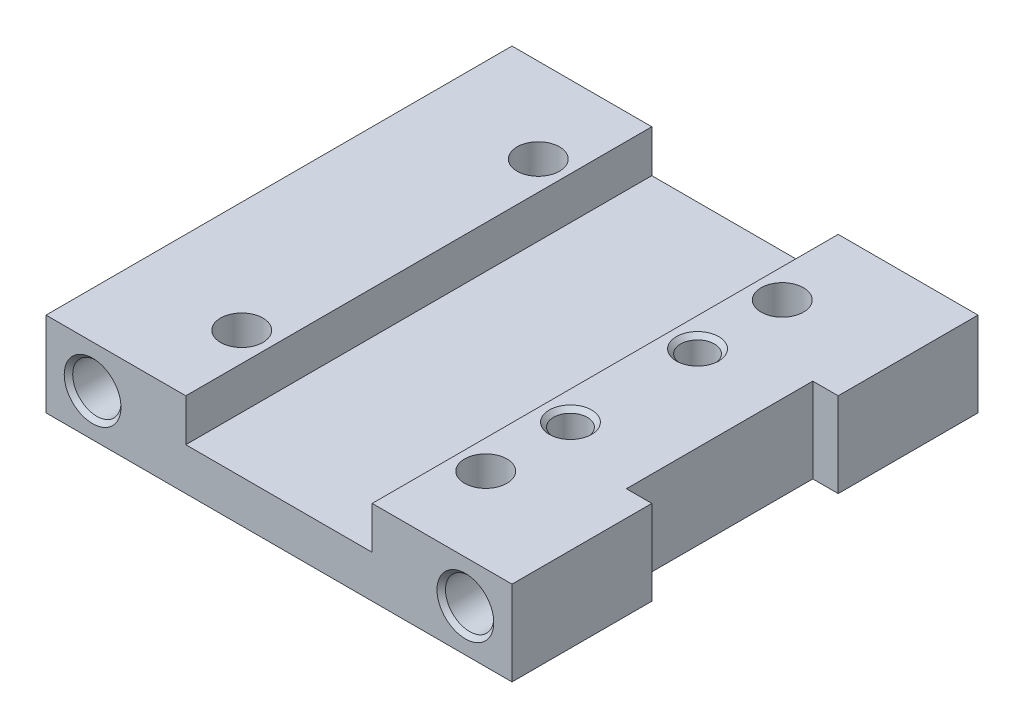
ISO-10303-21;
HEADER;
FILE_DESCRIPTION(('STEP AP214'),'2;1');
FILE_NAME('part.step','',(''),(''),'','','');
FILE_SCHEMA(('AUTOMOTIVE_DESIGN { 1 0 10303 214 1 1 1 1 }'));
ENDSEC;
DATA;
#1=APPLICATION_CONTEXT('core data for automotive mechanical design processes');
#2=APPLICATION_PROTOCOL_DEFINITION('international standard','automotive_design',2000,#1);
#3=PRODUCT_CONTEXT('',#1,'mechanical');
#4=PRODUCT('Part','Part','',(#3));
#5=PRODUCT_RELATED_PRODUCT_CATEGORY('part','',(#4));
#6=PRODUCT_DEFINITION_FORMATION('','',#4);
#7=PRODUCT_DEFINITION_CONTEXT('part definition',#1,'design');
#8=PRODUCT_DEFINITION('design','',#6,#7);
#9=PRODUCT_DEFINITION_SHAPE('','',#8);
#10=(LENGTH_UNIT() NAMED_UNIT(*) SI_UNIT(.MILLI.,.METRE.));
#11=(NAMED_UNIT(*) PLANE_ANGLE_UNIT() SI_UNIT($,.RADIAN.));
#12=(NAMED_UNIT(*) SI_UNIT($,.STERADIAN.) SOLID_ANGLE_UNIT());
#13=UNCERTAINTY_MEASURE_WITH_UNIT(LENGTH_MEASURE(1.E-05),#10,'distance_accuracy_value','');
#14=(GEOMETRIC_REPRESENTATION_CONTEXT(3) GLOBAL_UNCERTAINTY_ASSIGNED_CONTEXT((#13)) GLOBAL_UNIT_ASSIGNED_CONTEXT((#10,
#11,#12)) REPRESENTATION_CONTEXT('',''));
#15=CARTESIAN_POINT('',(0.,0.,0.));
#16=DIRECTION('',(0.,0.,1.));
#17=DIRECTION('',(1.,0.,0.));
#18=AXIS2_PLACEMENT_3D('',#15,#16,#17);
#19=CARTESIAN_POINT('',(0.,5.,0.));
#20=DIRECTION('',(0.,1.,0.));
#21=DIRECTION('',(0.,0.,1.));
#22=AXIS2_PLACEMENT_3D('',#19,#20,#21);
#23=PLANE('',#22);
#24=DIRECTION('',(0.,0.,-1.));
#25=VECTOR('',#24,1.);
#26=CARTESIAN_POINT('',(11.,5.,-27.5));
#27=LINE('',#26,#25);
#28=CARTESIAN_POINT('',(11.,5.,27.5));
#29=VERTEX_POINT('',#28);
#30=CARTESIAN_POINT('',(11.,5.,-27.5));
#31=VERTEX_POINT('',#30);
#32=EDGE_CURVE('E132',#29,#31,#27,.T.);
#33=ORIENTED_EDGE('',*,*,#32,.F.);
#34=DIRECTION('',(1.,0.,0.));
#35=VECTOR('',#34,1.);
#36=CARTESIAN_POINT('',(0.,5.,27.5));
#37=LINE('',#36,#35);
#38=CARTESIAN_POINT('',(27.5,5.,27.5));
#39=VERTEX_POINT('',#38);
#40=EDGE_CURVE('E122',#29,#39,#37,.T.);
#41=ORIENTED_EDGE('',*,*,#40,.T.);
#42=DIRECTION('',(0.,0.,1.));
#43=VECTOR('',#42,1.);
#44=CARTESIAN_POINT('',(27.5,5.,0.));
#45=LINE('',#44,#43);
#46=CARTESIAN_POINT('',(27.5,5.,11.));
#47=VERTEX_POINT('',#46);
#48=EDGE_CURVE('E126',#47,#39,#45,.T.);
#49=ORIENTED_EDGE('',*,*,#48,.F.);
#50=DIRECTION('',(-1.,0.,0.));
#51=VECTOR('',#50,1.);
#52=CARTESIAN_POINT('',(0.,5.,11.));
#53=LINE('',#52,#51);
#54=CARTESIAN_POINT('',(24.5,5.,11.));
#55=VERTEX_POINT('',#54);
#56=EDGE_CURVE('E70',#47,#55,#53,.T.);
#57=ORIENTED_EDGE('',*,*,#56,.T.);
#58=DIRECTION('',(0.,0.,1.));
#59=VECTOR('',#58,1.);
#60=CARTESIAN_POINT('',(24.5,5.,0.));
#61=LINE('',#60,#59);
#62=CARTESIAN_POINT('',(24.5,5.,-11.));
#63=VERTEX_POINT('',#62);
#64=EDGE_CURVE('E167',#63,#55,#61,.T.);
#65=ORIENTED_EDGE('',*,*,#64,.F.);
#66=DIRECTION('',(-1.,0.,0.));
#67=VECTOR('',#66,1.);
#68=CARTESIAN_POINT('',(0.,5.,-11.));
#69=LINE('',#68,#67);
#70=CARTESIAN_POINT('',(27.5,5.,-11.));
#71=VERTEX_POINT('',#70);
#72=EDGE_CURVE('E159',#71,#63,#69,.T.);
#73=ORIENTED_EDGE('',*,*,#72,.F.);
#74=CARTESIAN_POINT('',(27.5,5.,-27.5));
#75=VERTEX_POINT('',#74);
#76=EDGE_CURVE('E155',#75,#71,#45,.T.);
#77=ORIENTED_EDGE('',*,*,#76,.F.);
#78=DIRECTION('',(1.,0.,0.));
#79=VECTOR('',#78,1.);
#80=CARTESIAN_POINT('',(0.,5.,-27.5));
#81=LINE('',#80,#79);
#82=EDGE_CURVE('E157',#31,#75,#81,.T.);
#83=ORIENTED_EDGE('',*,*,#82,.F.);
#84=EDGE_LOOP('',(#33,#41,#49,#57,#65,#73,#77,#83));
#85=FACE_BOUND('',#84,.T.);
#86=CARTESIAN_POINT('',(14.4,5.,-17.5));
#87=DIRECTION('',(0.,1.,0.));
#88=DIRECTION('',(0.,0.,1.));
#89=AXIS2_PLACEMENT_3D('',#86,#87,#88);
#90=CIRCLE('',#89,2.5);
#91=CARTESIAN_POINT('',(14.4,5.,-15.));
#92=VERTEX_POINT('',#91);
#93=EDGE_CURVE('E166',#92,#92,#90,.T.);
#94=ORIENTED_EDGE('',*,*,#93,.F.);
#95=EDGE_LOOP('',(#94));
#96=FACE_BOUND('',#95,.T.);
#97=CARTESIAN_POINT('',(14.4,5.,17.5));
#98=DIRECTION('',(0.,1.,0.));
#99=DIRECTION('',(0.,0.,1.));
#100=AXIS2_PLACEMENT_3D('',#97,#98,#99);
#101=CIRCLE('',#100,2.5);
#102=CARTESIAN_POINT('',(14.4,5.,20.));
#103=VERTEX_POINT('',#102);
#104=EDGE_CURVE('E173',#103,#103,#101,.T.);
#105=ORIENTED_EDGE('',*,*,#104,.F.);
#106=EDGE_LOOP('',(#105));
#107=FACE_BOUND('',#106,.T.);
#108=CARTESIAN_POINT('',(14.4,5.,-7.5));
#109=DIRECTION('',(0.,1.,0.));
#110=DIRECTION('',(0.,0.,1.));
#111=AXIS2_PLACEMENT_3D('',#108,#109,#110);
#112=CIRCLE('',#111,2.5);
#113=CARTESIAN_POINT('',(14.4,5.,-5.));
#114=VERTEX_POINT('',#113);
#115=EDGE_CURVE('E650',#114,#114,#112,.F.);
#116=ORIENTED_EDGE('',*,*,#115,.T.);
#117=EDGE_LOOP('',(#116));
#118=FACE_BOUND('',#117,.T.);
#119=CARTESIAN_POINT('',(14.4,5.,7.5));
#120=DIRECTION('',(0.,1.,0.));
#121=DIRECTION('',(0.,0.,1.));
#122=AXIS2_PLACEMENT_3D('',#119,#120,#121);
#123=CIRCLE('',#122,2.50000000000002);
#124=CARTESIAN_POINT('',(14.4,5.,10.));
#125=VERTEX_POINT('',#124);
#126=EDGE_CURVE('E649',#125,#125,#123,.F.);
#127=ORIENTED_EDGE('',*,*,#126,.T.);
#128=EDGE_LOOP('',(#127));
#129=FACE_BOUND('',#128,.T.);
#130=ADVANCED_FACE('F45',(#85,#96,#107,#118,#129),#23,.T.);
#131=CARTESIAN_POINT('',(0.,5.,-27.5));
#132=DIRECTION('',(0.,0.,-1.));
#133=DIRECTION('',(-1.,0.,0.));
#134=AXIS2_PLACEMENT_3D('',#131,#132,#133);
#135=PLANE('',#134);
#136=CARTESIAN_POINT('',(-22.,0.,-27.5));
#137=DIRECTION('',(0.,0.,-1.));
#138=DIRECTION('',(-1.,0.,0.));
#139=AXIS2_PLACEMENT_3D('',#136,#137,#138);
#140=CIRCLE('',#139,3.35);
#141=CARTESIAN_POINT('',(-25.35,0.,-27.5));
#142=VERTEX_POINT('',#141);
#143=EDGE_CURVE('E658',#142,#142,#140,.F.);
#144=ORIENTED_EDGE('',*,*,#143,.T.);
#145=EDGE_LOOP('',(#144));
#146=FACE_BOUND('',#145,.T.);
#147=CARTESIAN_POINT('',(22.,0.,-27.5));
#148=DIRECTION('',(0.,0.,-1.));
#149=DIRECTION('',(-1.,0.,0.));
#150=AXIS2_PLACEMENT_3D('',#147,#148,#149);
#151=CIRCLE('',#150,3.35);
#152=CARTESIAN_POINT('',(18.65,0.,-27.5));
#153=VERTEX_POINT('',#152);
#154=EDGE_CURVE('E656',#153,#153,#151,.F.);
#155=ORIENTED_EDGE('',*,*,#154,.T.);
#156=EDGE_LOOP('',(#155));
#157=FACE_BOUND('',#156,.T.);
#158=DIRECTION('',(-1.,0.,0.));
#159=VECTOR('',#158,1.);
#160=CARTESIAN_POINT('',(-11.,0.,-27.5));
#161=LINE('',#160,#159);
#162=CARTESIAN_POINT('',(11.,0.,-27.5));
#163=VERTEX_POINT('',#162);
#164=CARTESIAN_POINT('',(-11.,0.,-27.5));
#165=VERTEX_POINT('',#164);
#166=EDGE_CURVE('E212',#163,#165,#161,.T.);
#167=ORIENTED_EDGE('',*,*,#166,.F.);
#168=DIRECTION('',(0.,1.,0.));
#169=VECTOR('',#168,1.);
#170=CARTESIAN_POINT('',(11.,0.,-27.5));
#171=LINE('',#170,#169);
#172=EDGE_CURVE('E191',#163,#31,#171,.T.);
#173=ORIENTED_EDGE('',*,*,#172,.T.);
#174=ORIENTED_EDGE('',*,*,#82,.T.);
#175=DIRECTION('',(0.,-1.,0.));
#176=VECTOR('',#175,1.);
#177=CARTESIAN_POINT('',(27.5,5.,-27.5));
#178=LINE('',#177,#176);
#179=CARTESIAN_POINT('',(27.5,-5.,-27.5));
#180=VERTEX_POINT('',#179);
#181=EDGE_CURVE('E615',#75,#180,#178,.T.);
#182=ORIENTED_EDGE('',*,*,#181,.T.);
#183=DIRECTION('',(1.,0.,0.));
#184=VECTOR('',#183,1.);
#185=CARTESIAN_POINT('',(0.,-5.,-27.5));
#186=LINE('',#185,#184);
#187=CARTESIAN_POINT('',(-27.5,-5.,-27.5));
#188=VERTEX_POINT('',#187);
#189=EDGE_CURVE('E618',#188,#180,#186,.T.);
#190=ORIENTED_EDGE('',*,*,#189,.F.);
#191=DIRECTION('',(0.,-1.,0.));
#192=VECTOR('',#191,1.);
#193=CARTESIAN_POINT('',(-27.5,5.,-27.5));
#194=LINE('',#193,#192);
#195=CARTESIAN_POINT('',(-27.5,5.,-27.5));
#196=VERTEX_POINT('',#195);
#197=EDGE_CURVE('E640',#196,#188,#194,.T.);
#198=ORIENTED_EDGE('',*,*,#197,.F.);
#199=CARTESIAN_POINT('',(-11.,5.,-27.5));
#200=VERTEX_POINT('',#199);
#201=EDGE_CURVE('E163',#196,#200,#81,.T.);
#202=ORIENTED_EDGE('',*,*,#201,.T.);
#203=DIRECTION('',(0.,1.,0.));
#204=VECTOR('',#203,1.);
#205=CARTESIAN_POINT('',(-11.,0.,-27.5));
#206=LINE('',#205,#204);
#207=EDGE_CURVE('E196',#165,#200,#206,.T.);
#208=ORIENTED_EDGE('',*,*,#207,.F.);
#209=EDGE_LOOP('',(#167,#173,#174,#182,#190,#198,#202,#208));
#210=FACE_BOUND('',#209,.T.);
#211=ADVANCED_FACE('F226',(#146,#157,#210),#135,.T.);
#212=CARTESIAN_POINT('',(24.5,5.,0.));
#213=DIRECTION('',(1.,0.,0.));
#214=DIRECTION('',(0.,0.,-1.));
#215=AXIS2_PLACEMENT_3D('',#212,#213,#214);
#216=PLANE('',#215);
#217=DIRECTION('',(0.,0.,1.));
#218=VECTOR('',#217,1.);
#219=CARTESIAN_POINT('',(24.5,-5.,0.));
#220=LINE('',#219,#218);
#221=CARTESIAN_POINT('',(24.5,-5.,-11.));
#222=VERTEX_POINT('',#221);
#223=CARTESIAN_POINT('',(24.5,-5.,11.));
#224=VERTEX_POINT('',#223);
#225=EDGE_CURVE('E674',#222,#224,#220,.T.);
#226=ORIENTED_EDGE('',*,*,#225,.F.);
#227=DIRECTION('',(0.,-1.,0.));
#228=VECTOR('',#227,1.);
#229=CARTESIAN_POINT('',(24.5,5.,-11.));
#230=LINE('',#229,#228);
#231=EDGE_CURVE('E106',#63,#222,#230,.T.);
#232=ORIENTED_EDGE('',*,*,#231,.F.);
#233=ORIENTED_EDGE('',*,*,#64,.T.);
#234=DIRECTION('',(0.,-1.,0.));
#235=VECTOR('',#234,1.);
#236=CARTESIAN_POINT('',(24.5,5.,11.));
#237=LINE('',#236,#235);
#238=EDGE_CURVE('E101',#55,#224,#237,.T.);
#239=ORIENTED_EDGE('',*,*,#238,.T.);
#240=EDGE_LOOP('',(#226,#232,#233,#239));
#241=FACE_BOUND('',#240,.T.);
#242=ADVANCED_FACE('F262',(#241),#216,.T.);
#243=CARTESIAN_POINT('',(0.,5.,-11.));
#244=DIRECTION('',(0.,0.,1.));
#245=DIRECTION('',(1.,0.,0.));
#246=AXIS2_PLACEMENT_3D('',#243,#244,#245);
#247=PLANE('',#246);
#248=DIRECTION('',(-1.,0.,0.));
#249=VECTOR('',#248,1.);
#250=CARTESIAN_POINT('',(0.,-5.,-11.));
#251=LINE('',#250,#249);
#252=CARTESIAN_POINT('',(27.5,-5.,-11.));
#253=VERTEX_POINT('',#252);
#254=EDGE_CURVE('E617',#253,#222,#251,.T.);
#255=ORIENTED_EDGE('',*,*,#254,.F.);
#256=DIRECTION('',(0.,-1.,0.));
#257=VECTOR('',#256,1.);
#258=CARTESIAN_POINT('',(27.5,5.,-11.));
#259=LINE('',#258,#257);
#260=EDGE_CURVE('E613',#71,#253,#259,.T.);
#261=ORIENTED_EDGE('',*,*,#260,.F.);
#262=ORIENTED_EDGE('',*,*,#72,.T.);
#263=ORIENTED_EDGE('',*,*,#231,.T.);
#264=EDGE_LOOP('',(#255,#261,#262,#263));
#265=FACE_BOUND('',#264,.T.);
#266=ADVANCED_FACE('F303',(#265),#247,.T.);
#267=CARTESIAN_POINT('',(27.5,5.,0.));
#268=DIRECTION('',(1.,0.,0.));
#269=DIRECTION('',(0.,0.,-1.));
#270=AXIS2_PLACEMENT_3D('',#267,#268,#269);
#271=PLANE('',#270);
#272=DIRECTION('',(0.,0.,1.));
#273=VECTOR('',#272,1.);
#274=CARTESIAN_POINT('',(27.5,-5.,0.));
#275=LINE('',#274,#273);
#276=EDGE_CURVE('E614',#180,#253,#275,.T.);
#277=ORIENTED_EDGE('',*,*,#276,.F.);
#278=ORIENTED_EDGE('',*,*,#181,.F.);
#279=ORIENTED_EDGE('',*,*,#76,.T.);
#280=ORIENTED_EDGE('',*,*,#260,.T.);
#281=EDGE_LOOP('',(#277,#278,#279,#280));
#282=FACE_BOUND('',#281,.T.);
#283=ADVANCED_FACE('F300',(#282),#271,.T.);
#284=CARTESIAN_POINT('',(-27.5,5.,0.));
#285=DIRECTION('',(1.,0.,0.));
#286=DIRECTION('',(0.,0.,-1.));
#287=AXIS2_PLACEMENT_3D('',#284,#285,#286);
#288=PLANE('',#287);
#289=DIRECTION('',(0.,0.,1.));
#290=VECTOR('',#289,1.);
#291=CARTESIAN_POINT('',(-27.5,-5.,0.));
#292=LINE('',#291,#290);
#293=CARTESIAN_POINT('',(-27.5,-5.,27.5));
#294=VERTEX_POINT('',#293);
#295=EDGE_CURVE('E627',#188,#294,#292,.T.);
#296=ORIENTED_EDGE('',*,*,#295,.T.);
#297=DIRECTION('',(0.,-1.,0.));
#298=VECTOR('',#297,1.);
#299=CARTESIAN_POINT('',(-27.5,5.,27.5));
#300=LINE('',#299,#298);
#301=CARTESIAN_POINT('',(-27.5,5.,27.5));
#302=VERTEX_POINT('',#301);
#303=EDGE_CURVE('E150',#302,#294,#300,.T.);
#304=ORIENTED_EDGE('',*,*,#303,.F.);
#305=DIRECTION('',(0.,0.,1.));
#306=VECTOR('',#305,1.);
#307=CARTESIAN_POINT('',(-27.5,5.,0.));
#308=LINE('',#307,#306);
#309=EDGE_CURVE('E133',#196,#302,#308,.T.);
#310=ORIENTED_EDGE('',*,*,#309,.F.);
#311=ORIENTED_EDGE('',*,*,#197,.T.);
#312=EDGE_LOOP('',(#296,#304,#310,#311));
#313=FACE_BOUND('',#312,.T.);
#314=ADVANCED_FACE('F296',(#313),#288,.F.);
#315=CARTESIAN_POINT('',(0.,5.,27.5));
#316=DIRECTION('',(0.,0.,-1.));
#317=DIRECTION('',(-1.,0.,0.));
#318=AXIS2_PLACEMENT_3D('',#315,#316,#317);
#319=PLANE('',#318);
#320=DIRECTION('',(1.,0.,0.));
#321=VECTOR('',#320,1.);
#322=CARTESIAN_POINT('',(-11.,0.,27.5));
#323=LINE('',#322,#321);
#324=CARTESIAN_POINT('',(-11.,0.,27.5));
#325=VERTEX_POINT('',#324);
#326=CARTESIAN_POINT('',(11.,0.,27.5));
#327=VERTEX_POINT('',#326);
#328=EDGE_CURVE('E200',#325,#327,#323,.T.);
#329=ORIENTED_EDGE('',*,*,#328,.F.);
#330=DIRECTION('',(0.,1.,0.));
#331=VECTOR('',#330,1.);
#332=CARTESIAN_POINT('',(-11.,0.,27.5));
#333=LINE('',#332,#331);
#334=CARTESIAN_POINT('',(-11.,5.,27.5));
#335=VERTEX_POINT('',#334);
#336=EDGE_CURVE('E205',#325,#335,#333,.T.);
#337=ORIENTED_EDGE('',*,*,#336,.T.);
#338=EDGE_CURVE('E131',#302,#335,#37,.T.);
#339=ORIENTED_EDGE('',*,*,#338,.F.);
#340=ORIENTED_EDGE('',*,*,#303,.T.);
#341=DIRECTION('',(1.,0.,0.));
#342=VECTOR('',#341,1.);
#343=CARTESIAN_POINT('',(0.,-5.,27.5));
#344=LINE('',#343,#342);
#345=CARTESIAN_POINT('',(27.5,-5.,27.5));
#346=VERTEX_POINT('',#345);
#347=EDGE_CURVE('E141',#294,#346,#344,.T.);
#348=ORIENTED_EDGE('',*,*,#347,.T.);
#349=DIRECTION('',(0.,-1.,0.));
#350=VECTOR('',#349,1.);
#351=CARTESIAN_POINT('',(27.5,5.,27.5));
#352=LINE('',#351,#350);
#353=EDGE_CURVE('E138',#39,#346,#352,.T.);
#354=ORIENTED_EDGE('',*,*,#353,.F.);
#355=ORIENTED_EDGE('',*,*,#40,.F.);
#356=DIRECTION('',(0.,1.,0.));
#357=VECTOR('',#356,1.);
#358=CARTESIAN_POINT('',(11.,0.,27.5));
#359=LINE('',#358,#357);
#360=EDGE_CURVE('E195',#327,#29,#359,.T.);
#361=ORIENTED_EDGE('',*,*,#360,.F.);
#362=EDGE_LOOP('',(#329,#337,#339,#340,#348,#354,#355,#361));
#363=FACE_BOUND('',#362,.T.);
#364=CARTESIAN_POINT('',(22.,0.,27.5));
#365=DIRECTION('',(0.,0.,-1.));
#366=DIRECTION('',(-1.,0.,0.));
#367=AXIS2_PLACEMENT_3D('',#364,#365,#366);
#368=CIRCLE('',#367,3.35);
#369=CARTESIAN_POINT('',(18.65,0.,27.5));
#370=VERTEX_POINT('',#369);
#371=EDGE_CURVE('E51',#370,#370,#368,.T.);
#372=ORIENTED_EDGE('',*,*,#371,.T.);
#373=EDGE_LOOP('',(#372));
#374=FACE_BOUND('',#373,.T.);
#375=CARTESIAN_POINT('',(-22.,0.,27.5));
#376=DIRECTION('',(0.,0.,-1.));
#377=DIRECTION('',(-1.,0.,0.));
#378=AXIS2_PLACEMENT_3D('',#375,#376,#377);
#379=CIRCLE('',#378,3.35);
#380=CARTESIAN_POINT('',(-25.35,0.,27.5));
#381=VERTEX_POINT('',#380);
#382=EDGE_CURVE('E365',#381,#381,#379,.T.);
#383=ORIENTED_EDGE('',*,*,#382,.T.);
#384=EDGE_LOOP('',(#383));
#385=FACE_BOUND('',#384,.T.);
#386=ADVANCED_FACE('F136',(#363,#374,#385),#319,.F.);
#387=CARTESIAN_POINT('',(27.5,-5.,11.));
#388=VERTEX_POINT('',#387);
#389=EDGE_CURVE('E622',#388,#346,#275,.T.);
#390=ORIENTED_EDGE('',*,*,#389,.F.);
#391=DIRECTION('',(0.,-1.,0.));
#392=VECTOR('',#391,1.);
#393=CARTESIAN_POINT('',(27.5,5.,11.));
#394=LINE('',#393,#392);
#395=EDGE_CURVE('E146',#47,#388,#394,.T.);
#396=ORIENTED_EDGE('',*,*,#395,.F.);
#397=ORIENTED_EDGE('',*,*,#48,.T.);
#398=ORIENTED_EDGE('',*,*,#353,.T.);
#399=EDGE_LOOP('',(#390,#396,#397,#398));
#400=FACE_BOUND('',#399,.T.);
#401=ADVANCED_FACE('F147',(#400),#271,.T.);
#402=CARTESIAN_POINT('',(0.,5.,11.));
#403=DIRECTION('',(0.,0.,1.));
#404=DIRECTION('',(1.,0.,0.));
#405=AXIS2_PLACEMENT_3D('',#402,#403,#404);
#406=PLANE('',#405);
#407=DIRECTION('',(-1.,0.,0.));
#408=VECTOR('',#407,1.);
#409=CARTESIAN_POINT('',(0.,-5.,11.));
#410=LINE('',#409,#408);
#411=EDGE_CURVE('E635',#388,#224,#410,.T.);
#412=ORIENTED_EDGE('',*,*,#411,.T.);
#413=ORIENTED_EDGE('',*,*,#238,.F.);
#414=ORIENTED_EDGE('',*,*,#56,.F.);
#415=ORIENTED_EDGE('',*,*,#395,.T.);
#416=EDGE_LOOP('',(#412,#413,#414,#415));
#417=FACE_BOUND('',#416,.T.);
#418=ADVANCED_FACE('F289',(#417),#406,.F.);
#419=CARTESIAN_POINT('',(14.4,5.,-7.5));
#420=DIRECTION('',(0.,-1.,0.));
#421=DIRECTION('',(0.,0.,-1.));
#422=AXIS2_PLACEMENT_3D('',#419,#420,#421);
#423=CYLINDRICAL_SURFACE('',#422,2.);
#424=CARTESIAN_POINT('',(14.4,4.5,-7.5));
#425=DIRECTION('',(0.,1.,0.));
#426=DIRECTION('',(0.,0.,1.));
#427=AXIS2_PLACEMENT_3D('',#424,#425,#426);
#428=CIRCLE('',#427,2.);
#429=CARTESIAN_POINT('',(14.4,4.5,-5.5));
#430=VERTEX_POINT('',#429);
#431=EDGE_CURVE('E653',#430,#430,#428,.T.);
#432=ORIENTED_EDGE('',*,*,#431,.T.);
#433=EDGE_LOOP('',(#432));
#434=FACE_BOUND('',#433,.T.);
#435=CARTESIAN_POINT('',(14.4,-5.,-7.5));
#436=DIRECTION('',(0.,1.,0.));
#437=DIRECTION('',(0.,0.,1.));
#438=AXIS2_PLACEMENT_3D('',#435,#436,#437);
#439=CIRCLE('',#438,2.);
#440=CARTESIAN_POINT('',(14.4,-5.,-5.5));
#441=VERTEX_POINT('',#440);
#442=EDGE_CURVE('E673',#441,#441,#439,.T.);
#443=ORIENTED_EDGE('',*,*,#442,.F.);
#444=EDGE_LOOP('',(#443));
#445=FACE_BOUND('',#444,.T.);
#446=ADVANCED_FACE('F291',(#434,#445),#423,.F.);
#447=CARTESIAN_POINT('',(14.4,5.,7.5));
#448=DIRECTION('',(0.,-1.,0.));
#449=DIRECTION('',(0.,0.,-1.));
#450=AXIS2_PLACEMENT_3D('',#447,#448,#449);
#451=CYLINDRICAL_SURFACE('',#450,2.);
#452=CARTESIAN_POINT('',(14.4,4.49999999999998,7.5));
#453=DIRECTION('',(0.,1.,0.));
#454=DIRECTION('',(0.,0.,1.));
#455=AXIS2_PLACEMENT_3D('',#452,#453,#454);
#456=CIRCLE('',#455,2.);
#457=CARTESIAN_POINT('',(14.4,4.49999999999998,9.5));
#458=VERTEX_POINT('',#457);
#459=EDGE_CURVE('E644',#458,#458,#456,.T.);
#460=ORIENTED_EDGE('',*,*,#459,.T.);
#461=EDGE_LOOP('',(#460));
#462=FACE_BOUND('',#461,.T.);
#463=CARTESIAN_POINT('',(14.4,-5.,7.5));
#464=DIRECTION('',(0.,1.,0.));
#465=DIRECTION('',(0.,0.,1.));
#466=AXIS2_PLACEMENT_3D('',#463,#464,#465);
#467=CIRCLE('',#466,2.);
#468=CARTESIAN_POINT('',(14.4,-5.,9.5));
#469=VERTEX_POINT('',#468);
#470=EDGE_CURVE('E677',#469,#469,#467,.T.);
#471=ORIENTED_EDGE('',*,*,#470,.F.);
#472=EDGE_LOOP('',(#471));
#473=FACE_BOUND('',#472,.T.);
#474=ADVANCED_FACE('F309',(#462,#473),#451,.F.);
#475=CARTESIAN_POINT('',(14.4,5.,-17.5));
#476=DIRECTION('',(0.,-1.,0.));
#477=DIRECTION('',(0.,0.,-1.));
#478=AXIS2_PLACEMENT_3D('',#475,#476,#477);
#479=CYLINDRICAL_SURFACE('',#478,2.5);
#480=ORIENTED_EDGE('',*,*,#93,.T.);
#481=EDGE_LOOP('',(#480));
#482=FACE_BOUND('',#481,.T.);
#483=CARTESIAN_POINT('',(14.4,-5.,-17.5));
#484=DIRECTION('',(0.,1.,0.));
#485=DIRECTION('',(0.,0.,1.));
#486=AXIS2_PLACEMENT_3D('',#483,#484,#485);
#487=CIRCLE('',#486,2.5);
#488=CARTESIAN_POINT('',(14.4,-5.,-15.));
#489=VERTEX_POINT('',#488);
#490=EDGE_CURVE('E678',#489,#489,#487,.T.);
#491=ORIENTED_EDGE('',*,*,#490,.F.);
#492=EDGE_LOOP('',(#491));
#493=FACE_BOUND('',#492,.T.);
#494=ADVANCED_FACE('F314',(#482,#493),#479,.F.);
#495=CARTESIAN_POINT('',(14.4,5.,17.5));
#496=DIRECTION('',(0.,-1.,0.));
#497=DIRECTION('',(0.,0.,-1.));
#498=AXIS2_PLACEMENT_3D('',#495,#496,#497);
#499=CYLINDRICAL_SURFACE('',#498,2.5);
#500=ORIENTED_EDGE('',*,*,#104,.T.);
#501=EDGE_LOOP('',(#500));
#502=FACE_BOUND('',#501,.T.);
#503=CARTESIAN_POINT('',(14.4,-5.,17.5));
#504=DIRECTION('',(0.,1.,0.));
#505=DIRECTION('',(0.,0.,1.));
#506=AXIS2_PLACEMENT_3D('',#503,#504,#505);
#507=CIRCLE('',#506,2.5);
#508=CARTESIAN_POINT('',(14.4,-5.,20.));
#509=VERTEX_POINT('',#508);
#510=EDGE_CURVE('E687',#509,#509,#507,.T.);
#511=ORIENTED_EDGE('',*,*,#510,.F.);
#512=EDGE_LOOP('',(#511));
#513=FACE_BOUND('',#512,.T.);
#514=ADVANCED_FACE('F283',(#502,#513),#499,.F.);
#515=CARTESIAN_POINT('',(-14.4,5.,17.5));
#516=DIRECTION('',(0.,-1.,0.));
#517=DIRECTION('',(0.,0.,-1.));
#518=AXIS2_PLACEMENT_3D('',#515,#516,#517);
#519=CYLINDRICAL_SURFACE('',#518,2.5);
#520=CARTESIAN_POINT('',(-14.4,5.,17.5));
#521=DIRECTION('',(0.,1.,0.));
#522=DIRECTION('',(0.,0.,1.));
#523=AXIS2_PLACEMENT_3D('',#520,#521,#522);
#524=CIRCLE('',#523,2.5);
#525=CARTESIAN_POINT('',(-14.4,5.,20.));
#526=VERTEX_POINT('',#525);
#527=EDGE_CURVE('E180',#526,#526,#524,.F.);
#528=ORIENTED_EDGE('',*,*,#527,.F.);
#529=EDGE_LOOP('',(#528));
#530=FACE_BOUND('',#529,.T.);
#531=CARTESIAN_POINT('',(-14.4,-5.,17.5));
#532=DIRECTION('',(0.,1.,0.));
#533=DIRECTION('',(0.,0.,1.));
#534=AXIS2_PLACEMENT_3D('',#531,#532,#533);
#535=CIRCLE('',#534,2.5);
#536=CARTESIAN_POINT('',(-14.4,-5.,20.));
#537=VERTEX_POINT('',#536);
#538=EDGE_CURVE('E189',#537,#537,#535,.F.);
#539=ORIENTED_EDGE('',*,*,#538,.T.);
#540=EDGE_LOOP('',(#539));
#541=FACE_BOUND('',#540,.T.);
#542=ADVANCED_FACE('F279',(#530,#541),#519,.F.);
#543=CARTESIAN_POINT('',(-14.4,5.,-17.5));
#544=DIRECTION('',(0.,-1.,0.));
#545=DIRECTION('',(0.,0.,-1.));
#546=AXIS2_PLACEMENT_3D('',#543,#544,#545);
#547=CYLINDRICAL_SURFACE('',#546,2.5);
#548=CARTESIAN_POINT('',(-14.4,5.,-17.5));
#549=DIRECTION('',(0.,1.,0.));
#550=DIRECTION('',(0.,0.,1.));
#551=AXIS2_PLACEMENT_3D('',#548,#549,#550);
#552=CIRCLE('',#551,2.5);
#553=CARTESIAN_POINT('',(-14.4,5.,-15.));
#554=VERTEX_POINT('',#553);
#555=EDGE_CURVE('E153',#554,#554,#552,.F.);
#556=ORIENTED_EDGE('',*,*,#555,.F.);
#557=EDGE_LOOP('',(#556));
#558=FACE_BOUND('',#557,.T.);
#559=CARTESIAN_POINT('',(-14.4,-5.,-17.5));
#560=DIRECTION('',(0.,1.,0.));
#561=DIRECTION('',(0.,0.,1.));
#562=AXIS2_PLACEMENT_3D('',#559,#560,#561);
#563=CIRCLE('',#562,2.5);
#564=CARTESIAN_POINT('',(-14.4,-5.,-15.));
#565=VERTEX_POINT('',#564);
#566=EDGE_CURVE('E179',#565,#565,#563,.F.);
#567=ORIENTED_EDGE('',*,*,#566,.T.);
#568=EDGE_LOOP('',(#567));
#569=FACE_BOUND('',#568,.T.);
#570=ADVANCED_FACE('F269',(#558,#569),#547,.F.);
#571=DIRECTION('',(0.,0.,1.));
#572=VECTOR('',#571,1.);
#573=CARTESIAN_POINT('',(-11.,5.,-27.5));
#574=LINE('',#573,#572);
#575=EDGE_CURVE('E210',#200,#335,#574,.T.);
#576=ORIENTED_EDGE('',*,*,#575,.F.);
#577=ORIENTED_EDGE('',*,*,#201,.F.);
#578=ORIENTED_EDGE('',*,*,#309,.T.);
#579=ORIENTED_EDGE('',*,*,#338,.T.);
#580=EDGE_LOOP('',(#576,#577,#578,#579));
#581=FACE_BOUND('',#580,.T.);
#582=ORIENTED_EDGE('',*,*,#527,.T.);
#583=EDGE_LOOP('',(#582));
#584=FACE_BOUND('',#583,.T.);
#585=ORIENTED_EDGE('',*,*,#555,.T.);
#586=EDGE_LOOP('',(#585));
#587=FACE_BOUND('',#586,.T.);
#588=ADVANCED_FACE('F239',(#581,#584,#587),#23,.T.);
#589=CARTESIAN_POINT('',(0.,-5.,0.));
#590=DIRECTION('',(0.,1.,0.));
#591=DIRECTION('',(0.,0.,1.));
#592=AXIS2_PLACEMENT_3D('',#589,#590,#591);
#593=PLANE('',#592);
#594=ORIENTED_EDGE('',*,*,#538,.F.);
#595=EDGE_LOOP('',(#594));
#596=FACE_BOUND('',#595,.T.);
#597=ORIENTED_EDGE('',*,*,#510,.T.);
#598=EDGE_LOOP('',(#597));
#599=FACE_BOUND('',#598,.T.);
#600=ORIENTED_EDGE('',*,*,#490,.T.);
#601=EDGE_LOOP('',(#600));
#602=FACE_BOUND('',#601,.T.);
#603=ORIENTED_EDGE('',*,*,#470,.T.);
#604=EDGE_LOOP('',(#603));
#605=FACE_BOUND('',#604,.T.);
#606=ORIENTED_EDGE('',*,*,#442,.T.);
#607=EDGE_LOOP('',(#606));
#608=FACE_BOUND('',#607,.T.);
#609=ORIENTED_EDGE('',*,*,#225,.T.);
#610=ORIENTED_EDGE('',*,*,#411,.F.);
#611=ORIENTED_EDGE('',*,*,#389,.T.);
#612=ORIENTED_EDGE('',*,*,#347,.F.);
#613=ORIENTED_EDGE('',*,*,#295,.F.);
#614=ORIENTED_EDGE('',*,*,#189,.T.);
#615=ORIENTED_EDGE('',*,*,#276,.T.);
#616=ORIENTED_EDGE('',*,*,#254,.T.);
#617=EDGE_LOOP('',(#609,#610,#611,#612,#613,#614,#615,#616));
#618=FACE_BOUND('',#617,.T.);
#619=ORIENTED_EDGE('',*,*,#566,.F.);
#620=EDGE_LOOP('',(#619));
#621=FACE_BOUND('',#620,.T.);
#622=ADVANCED_FACE('F267',(#596,#599,#602,#605,#608,#618,#621),#593,.F.);
#623=CARTESIAN_POINT('',(22.,0.,19.5));
#624=DIRECTION('',(0.,0.,1.));
#625=DIRECTION('',(1.,0.,0.));
#626=AXIS2_PLACEMENT_3D('',#623,#624,#625);
#627=CYLINDRICAL_SURFACE('',#626,2.85);
#628=CARTESIAN_POINT('',(22.,0.,27.));
#629=DIRECTION('',(0.,0.,-1.));
#630=DIRECTION('',(-1.,0.,0.));
#631=AXIS2_PLACEMENT_3D('',#628,#629,#630);
#632=CIRCLE('',#631,2.85);
#633=CARTESIAN_POINT('',(19.15,0.,27.));
#634=VERTEX_POINT('',#633);
#635=EDGE_CURVE('E362',#634,#634,#632,.F.);
#636=ORIENTED_EDGE('',*,*,#635,.T.);
#637=EDGE_LOOP('',(#636));
#638=FACE_BOUND('',#637,.T.);
#639=CARTESIAN_POINT('',(22.,0.,19.5));
#640=DIRECTION('',(0.,0.,1.));
#641=DIRECTION('',(-1.,0.,0.));
#642=AXIS2_PLACEMENT_3D('',#639,#640,#641);
#643=CIRCLE('',#642,2.85);
#644=CARTESIAN_POINT('',(19.15,0.,19.5));
#645=VERTEX_POINT('',#644);
#646=EDGE_CURVE('E182',#645,#645,#643,.T.);
#647=ORIENTED_EDGE('',*,*,#646,.F.);
#648=EDGE_LOOP('',(#647));
#649=FACE_BOUND('',#648,.T.);
#650=ADVANCED_FACE('F274',(#638,#649),#627,.F.);
#651=CARTESIAN_POINT('',(22.,0.,19.5));
#652=DIRECTION('',(0.,0.,-1.));
#653=DIRECTION('',(-1.,0.,0.));
#654=AXIS2_PLACEMENT_3D('',#651,#652,#653);
#655=PLANE('',#654);
#656=ORIENTED_EDGE('',*,*,#646,.T.);
#657=EDGE_LOOP('',(#656));
#658=FACE_BOUND('',#657,.T.);
#659=ADVANCED_FACE('F385',(#658),#655,.F.);
#660=CARTESIAN_POINT('',(-22.,0.,19.5));
#661=DIRECTION('',(0.,0.,1.));
#662=DIRECTION('',(1.,0.,0.));
#663=AXIS2_PLACEMENT_3D('',#660,#661,#662);
#664=CYLINDRICAL_SURFACE('',#663,2.85);
#665=CARTESIAN_POINT('',(-22.,0.,27.));
#666=DIRECTION('',(0.,0.,-1.));
#667=DIRECTION('',(-1.,0.,0.));
#668=AXIS2_PLACEMENT_3D('',#665,#666,#667);
#669=CIRCLE('',#668,2.85);
#670=CARTESIAN_POINT('',(-24.85,0.,27.));
#671=VERTEX_POINT('',#670);
#672=EDGE_CURVE('E11',#671,#671,#669,.F.);
#673=ORIENTED_EDGE('',*,*,#672,.T.);
#674=EDGE_LOOP('',(#673));
#675=FACE_BOUND('',#674,.T.);
#676=CARTESIAN_POINT('',(-22.,0.,19.5));
#677=DIRECTION('',(0.,0.,1.));
#678=DIRECTION('',(1.,0.,0.));
#679=AXIS2_PLACEMENT_3D('',#676,#677,#678);
#680=CIRCLE('',#679,2.85);
#681=CARTESIAN_POINT('',(-19.15,0.,19.5));
#682=VERTEX_POINT('',#681);
#683=EDGE_CURVE('E184',#682,#682,#680,.T.);
#684=ORIENTED_EDGE('',*,*,#683,.F.);
#685=EDGE_LOOP('',(#684));
#686=FACE_BOUND('',#685,.T.);
#687=ADVANCED_FACE('F378',(#675,#686),#664,.F.);
#688=CARTESIAN_POINT('',(-22.,0.,19.5));
#689=DIRECTION('',(0.,0.,1.));
#690=DIRECTION('',(1.,0.,0.));
#691=AXIS2_PLACEMENT_3D('',#688,#689,#690);
#692=PLANE('',#691);
#693=ORIENTED_EDGE('',*,*,#683,.T.);
#694=EDGE_LOOP('',(#693));
#695=FACE_BOUND('',#694,.T.);
#696=ADVANCED_FACE('F381',(#695),#692,.T.);
#697=CARTESIAN_POINT('',(22.,0.,-19.5));
#698=DIRECTION('',(0.,0.,-1.));
#699=DIRECTION('',(-1.,0.,0.));
#700=AXIS2_PLACEMENT_3D('',#697,#698,#699);
#701=CYLINDRICAL_SURFACE('',#700,2.85);
#702=CARTESIAN_POINT('',(22.,0.,-27.));
#703=DIRECTION('',(0.,0.,-1.));
#704=DIRECTION('',(-1.,0.,0.));
#705=AXIS2_PLACEMENT_3D('',#702,#703,#704);
#706=CIRCLE('',#705,2.85);
#707=CARTESIAN_POINT('',(19.15,0.,-27.));
#708=VERTEX_POINT('',#707);
#709=EDGE_CURVE('E364',#708,#708,#706,.T.);
#710=ORIENTED_EDGE('',*,*,#709,.T.);
#711=EDGE_LOOP('',(#710));
#712=FACE_BOUND('',#711,.T.);
#713=CARTESIAN_POINT('',(22.,0.,-19.5));
#714=DIRECTION('',(0.,0.,1.));
#715=DIRECTION('',(-1.,0.,0.));
#716=AXIS2_PLACEMENT_3D('',#713,#714,#715);
#717=CIRCLE('',#716,2.85);
#718=CARTESIAN_POINT('',(19.15,0.,-19.5));
#719=VERTEX_POINT('',#718);
#720=EDGE_CURVE('E186',#719,#719,#717,.T.);
#721=ORIENTED_EDGE('',*,*,#720,.T.);
#722=EDGE_LOOP('',(#721));
#723=FACE_BOUND('',#722,.T.);
#724=ADVANCED_FACE('F390',(#712,#723),#701,.F.);
#725=CARTESIAN_POINT('',(22.,0.,-19.5));
#726=DIRECTION('',(0.,0.,1.));
#727=DIRECTION('',(-1.,0.,0.));
#728=AXIS2_PLACEMENT_3D('',#725,#726,#727);
#729=PLANE('',#728);
#730=ORIENTED_EDGE('',*,*,#720,.F.);
#731=EDGE_LOOP('',(#730));
#732=FACE_BOUND('',#731,.T.);
#733=ADVANCED_FACE('F393',(#732),#729,.F.);
#734=CARTESIAN_POINT('',(-22.,0.,-19.5));
#735=DIRECTION('',(0.,0.,-1.));
#736=DIRECTION('',(-1.,0.,0.));
#737=AXIS2_PLACEMENT_3D('',#734,#735,#736);
#738=CYLINDRICAL_SURFACE('',#737,2.85);
#739=CARTESIAN_POINT('',(-22.,0.,-27.));
#740=DIRECTION('',(0.,0.,-1.));
#741=DIRECTION('',(-1.,0.,0.));
#742=AXIS2_PLACEMENT_3D('',#739,#740,#741);
#743=CIRCLE('',#742,2.85);
#744=CARTESIAN_POINT('',(-24.85,0.,-27.));
#745=VERTEX_POINT('',#744);
#746=EDGE_CURVE('E367',#745,#745,#743,.T.);
#747=ORIENTED_EDGE('',*,*,#746,.T.);
#748=EDGE_LOOP('',(#747));
#749=FACE_BOUND('',#748,.T.);
#750=CARTESIAN_POINT('',(-22.,0.,-19.5));
#751=DIRECTION('',(0.,0.,1.));
#752=DIRECTION('',(1.,0.,0.));
#753=AXIS2_PLACEMENT_3D('',#750,#751,#752);
#754=CIRCLE('',#753,2.85);
#755=CARTESIAN_POINT('',(-19.15,0.,-19.5));
#756=VERTEX_POINT('',#755);
#757=EDGE_CURVE('E183',#756,#756,#754,.T.);
#758=ORIENTED_EDGE('',*,*,#757,.T.);
#759=EDGE_LOOP('',(#758));
#760=FACE_BOUND('',#759,.T.);
#761=ADVANCED_FACE('F440',(#749,#760),#738,.F.);
#762=CARTESIAN_POINT('',(-22.,0.,-19.5));
#763=DIRECTION('',(0.,0.,-1.));
#764=DIRECTION('',(1.,0.,0.));
#765=AXIS2_PLACEMENT_3D('',#762,#763,#764);
#766=PLANE('',#765);
#767=ORIENTED_EDGE('',*,*,#757,.F.);
#768=EDGE_LOOP('',(#767));
#769=FACE_BOUND('',#768,.T.);
#770=ADVANCED_FACE('F329',(#769),#766,.T.);
#771=CARTESIAN_POINT('',(14.4,4.49999999999998,7.5));
#772=DIRECTION('',(0.,1.,0.));
#773=DIRECTION('',(0.,0.,1.));
#774=AXIS2_PLACEMENT_3D('',#771,#772,#773);
#775=CONICAL_SURFACE('',#774,2.,0.785398163397449);
#776=ORIENTED_EDGE('',*,*,#126,.F.);
#777=EDGE_LOOP('',(#776));
#778=FACE_BOUND('',#777,.T.);
#779=ORIENTED_EDGE('',*,*,#459,.F.);
#780=EDGE_LOOP('',(#779));
#781=FACE_BOUND('',#780,.T.);
#782=ADVANCED_FACE('F323',(#778,#781),#775,.F.);
#783=CARTESIAN_POINT('',(14.4,4.5,-7.5));
#784=DIRECTION('',(0.,1.,0.));
#785=DIRECTION('',(0.,0.,1.));
#786=AXIS2_PLACEMENT_3D('',#783,#784,#785);
#787=CONICAL_SURFACE('',#786,2.,0.785398163397449);
#788=ORIENTED_EDGE('',*,*,#115,.F.);
#789=EDGE_LOOP('',(#788));
#790=FACE_BOUND('',#789,.T.);
#791=ORIENTED_EDGE('',*,*,#431,.F.);
#792=EDGE_LOOP('',(#791));
#793=FACE_BOUND('',#792,.T.);
#794=ADVANCED_FACE('F328',(#790,#793),#787,.F.);
#795=CARTESIAN_POINT('',(-22.,0.,-27.5));
#796=DIRECTION('',(0.,0.,-1.));
#797=DIRECTION('',(-1.,0.,0.));
#798=AXIS2_PLACEMENT_3D('',#795,#796,#797);
#799=CONICAL_SURFACE('',#798,3.35,0.785398163397451);
#800=ORIENTED_EDGE('',*,*,#746,.F.);
#801=EDGE_LOOP('',(#800));
#802=FACE_BOUND('',#801,.T.);
#803=ORIENTED_EDGE('',*,*,#143,.F.);
#804=EDGE_LOOP('',(#803));
#805=FACE_BOUND('',#804,.T.);
#806=ADVANCED_FACE('F336',(#802,#805),#799,.F.);
#807=CARTESIAN_POINT('',(22.,0.,-27.5));
#808=DIRECTION('',(0.,0.,-1.));
#809=DIRECTION('',(-1.,0.,0.));
#810=AXIS2_PLACEMENT_3D('',#807,#808,#809);
#811=CONICAL_SURFACE('',#810,3.35,0.785398163397451);
#812=ORIENTED_EDGE('',*,*,#709,.F.);
#813=EDGE_LOOP('',(#812));
#814=FACE_BOUND('',#813,.T.);
#815=ORIENTED_EDGE('',*,*,#154,.F.);
#816=EDGE_LOOP('',(#815));
#817=FACE_BOUND('',#816,.T.);
#818=ADVANCED_FACE('F342',(#814,#817),#811,.F.);
#819=CARTESIAN_POINT('',(22.,0.,27.));
#820=DIRECTION('',(0.,0.,1.));
#821=DIRECTION('',(1.,0.,0.));
#822=AXIS2_PLACEMENT_3D('',#819,#820,#821);
#823=CONICAL_SURFACE('',#822,2.85,0.785398163397461);
#824=ORIENTED_EDGE('',*,*,#371,.F.);
#825=EDGE_LOOP('',(#824));
#826=FACE_BOUND('',#825,.T.);
#827=ORIENTED_EDGE('',*,*,#635,.F.);
#828=EDGE_LOOP('',(#827));
#829=FACE_BOUND('',#828,.T.);
#830=ADVANCED_FACE('F258',(#826,#829),#823,.F.);
#831=CARTESIAN_POINT('',(-22.,0.,27.));
#832=DIRECTION('',(0.,0.,1.));
#833=DIRECTION('',(1.,0.,0.));
#834=AXIS2_PLACEMENT_3D('',#831,#832,#833);
#835=CONICAL_SURFACE('',#834,2.85,0.785398163397461);
#836=ORIENTED_EDGE('',*,*,#382,.F.);
#837=EDGE_LOOP('',(#836));
#838=FACE_BOUND('',#837,.T.);
#839=ORIENTED_EDGE('',*,*,#672,.F.);
#840=EDGE_LOOP('',(#839));
#841=FACE_BOUND('',#840,.T.);
#842=ADVANCED_FACE('F44',(#838,#841),#835,.F.);
#843=CARTESIAN_POINT('',(11.,0.,-27.5));
#844=DIRECTION('',(1.,0.,0.));
#845=DIRECTION('',(0.,0.,-1.));
#846=AXIS2_PLACEMENT_3D('',#843,#844,#845);
#847=PLANE('',#846);
#848=ORIENTED_EDGE('',*,*,#32,.T.);
#849=ORIENTED_EDGE('',*,*,#172,.F.);
#850=DIRECTION('',(0.,0.,-1.));
#851=VECTOR('',#850,1.);
#852=CARTESIAN_POINT('',(11.,0.,-27.5));
#853=LINE('',#852,#851);
#854=EDGE_CURVE('E209',#327,#163,#853,.T.);
#855=ORIENTED_EDGE('',*,*,#854,.F.);
#856=ORIENTED_EDGE('',*,*,#360,.T.);
#857=EDGE_LOOP('',(#848,#849,#855,#856));
#858=FACE_BOUND('',#857,.T.);
#859=ADVANCED_FACE('F247',(#858),#847,.F.);
#860=CARTESIAN_POINT('',(-11.,0.,-27.5));
#861=DIRECTION('',(-1.,0.,0.));
#862=DIRECTION('',(0.,0.,1.));
#863=AXIS2_PLACEMENT_3D('',#860,#861,#862);
#864=PLANE('',#863);
#865=ORIENTED_EDGE('',*,*,#575,.T.);
#866=ORIENTED_EDGE('',*,*,#336,.F.);
#867=DIRECTION('',(0.,0.,1.));
#868=VECTOR('',#867,1.);
#869=CARTESIAN_POINT('',(-11.,0.,-27.5));
#870=LINE('',#869,#868);
#871=EDGE_CURVE('E59',#165,#325,#870,.T.);
#872=ORIENTED_EDGE('',*,*,#871,.F.);
#873=ORIENTED_EDGE('',*,*,#207,.T.);
#874=EDGE_LOOP('',(#865,#866,#872,#873));
#875=FACE_BOUND('',#874,.T.);
#876=ADVANCED_FACE('F234',(#875),#864,.F.);
#877=CARTESIAN_POINT('',(0.,0.,0.));
#878=DIRECTION('',(0.,1.,0.));
#879=DIRECTION('',(0.,0.,1.));
#880=AXIS2_PLACEMENT_3D('',#877,#878,#879);
#881=PLANE('',#880);
#882=ORIENTED_EDGE('',*,*,#854,.T.);
#883=ORIENTED_EDGE('',*,*,#166,.T.);
#884=ORIENTED_EDGE('',*,*,#871,.T.);
#885=ORIENTED_EDGE('',*,*,#328,.T.);
#886=EDGE_LOOP('',(#882,#883,#884,#885));
#887=FACE_BOUND('',#886,.T.);
#888=ADVANCED_FACE('F219',(#887),#881,.T.);
#889=CLOSED_SHELL('',(#130,#211,#242,#266,#283,#314,#386,#401,#418,#446,#474,#494,#514,#542,
#570,#588,#622,#650,#659,#687,#696,#724,#733,#761,#770,#782,#794,#806,#818,#830,#842,#859,#876,#888));
#890=MANIFOLD_SOLID_BREP('B2',#889);
#891=ADVANCED_BREP_SHAPE_REPRESENTATION('',(#18,#890),#14);
#892=SHAPE_DEFINITION_REPRESENTATION(#9,#891);
ENDSEC;
END-ISO-10303-21;
